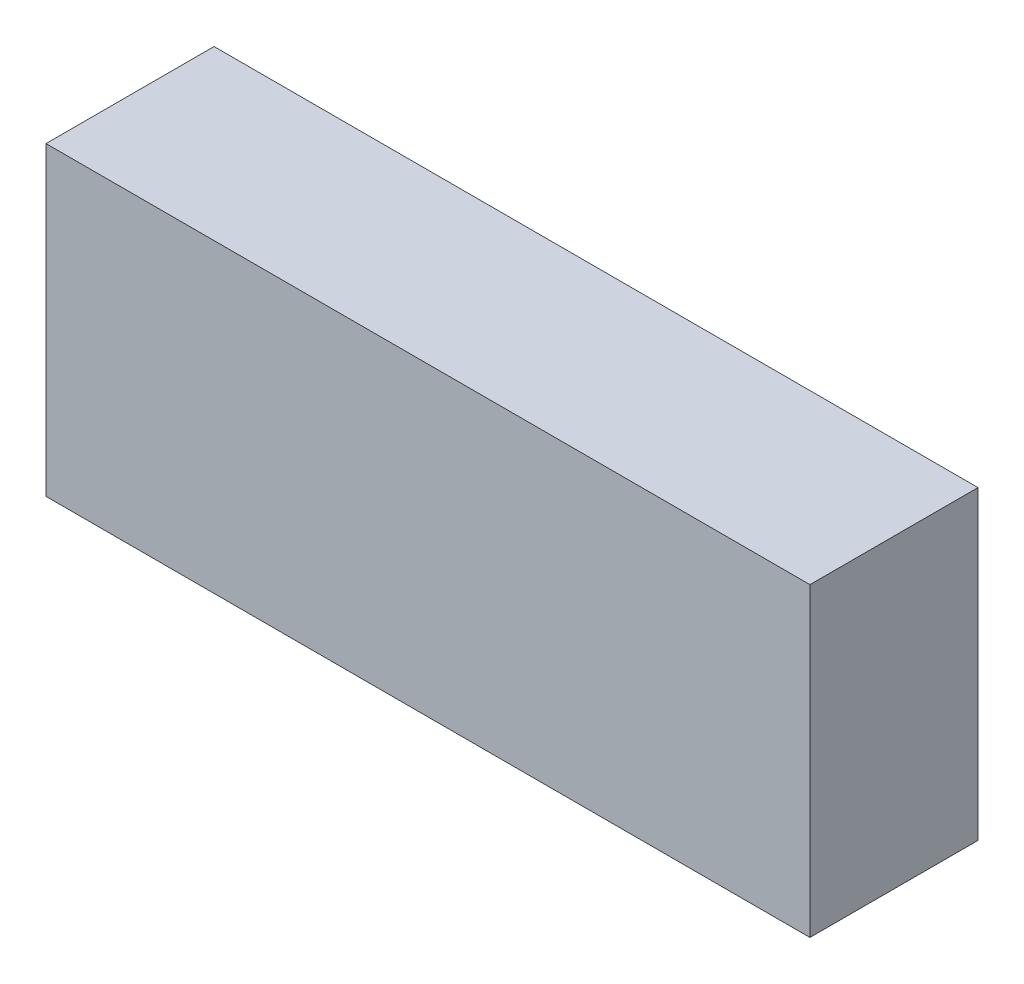
ISO-10303-21;
HEADER;
FILE_DESCRIPTION(('STEP AP214'),'2;1');
FILE_NAME('part.step','',(''),(''),'','','');
FILE_SCHEMA(('AUTOMOTIVE_DESIGN { 1 0 10303 214 1 1 1 1 }'));
ENDSEC;
DATA;
#1=APPLICATION_CONTEXT('core data for automotive mechanical design processes');
#2=APPLICATION_PROTOCOL_DEFINITION('international standard','automotive_design',2000,#1);
#3=PRODUCT_CONTEXT('',#1,'mechanical');
#4=PRODUCT('Part','Part','',(#3));
#5=PRODUCT_RELATED_PRODUCT_CATEGORY('part','',(#4));
#6=PRODUCT_DEFINITION_FORMATION('','',#4);
#7=PRODUCT_DEFINITION_CONTEXT('part definition',#1,'design');
#8=PRODUCT_DEFINITION('design','',#6,#7);
#9=PRODUCT_DEFINITION_SHAPE('','',#8);
#10=(LENGTH_UNIT() NAMED_UNIT(*) SI_UNIT(.MILLI.,.METRE.));
#11=(NAMED_UNIT(*) PLANE_ANGLE_UNIT() SI_UNIT($,.RADIAN.));
#12=(NAMED_UNIT(*) SI_UNIT($,.STERADIAN.) SOLID_ANGLE_UNIT());
#13=UNCERTAINTY_MEASURE_WITH_UNIT(LENGTH_MEASURE(1.E-05),#10,'distance_accuracy_value','');
#14=(GEOMETRIC_REPRESENTATION_CONTEXT(3) GLOBAL_UNCERTAINTY_ASSIGNED_CONTEXT((#13)) GLOBAL_UNIT_ASSIGNED_CONTEXT((#10,
#11,#12)) REPRESENTATION_CONTEXT('',''));
#15=CARTESIAN_POINT('',(0.,0.,0.));
#16=DIRECTION('',(0.,0.,1.));
#17=DIRECTION('',(1.,0.,0.));
#18=AXIS2_PLACEMENT_3D('',#15,#16,#17);
#19=CARTESIAN_POINT('',(0.,0.,22.));
#20=DIRECTION('',(1.,0.,0.));
#21=DIRECTION('',(0.,1.,0.));
#22=AXIS2_PLACEMENT_3D('',#19,#20,#21);
#23=PLANE('',#22);
#24=DIRECTION('',(0.,-1.,0.));
#25=VECTOR('',#24,1.);
#26=CARTESIAN_POINT('',(0.,0.,0.));
#27=LINE('',#26,#25);
#28=CARTESIAN_POINT('',(0.,0.,0.));
#29=VERTEX_POINT('',#28);
#30=CARTESIAN_POINT('',(0.,-40.,0.));
#31=VERTEX_POINT('',#30);
#32=EDGE_CURVE('E96',#29,#31,#27,.T.);
#33=ORIENTED_EDGE('',*,*,#32,.T.);
#34=DIRECTION('',(0.,0.,-1.));
#35=VECTOR('',#34,1.);
#36=CARTESIAN_POINT('',(0.,-40.,22.));
#37=LINE('',#36,#35);
#38=CARTESIAN_POINT('',(0.,-40.,22.));
#39=VERTEX_POINT('',#38);
#40=EDGE_CURVE('E11',#39,#31,#37,.T.);
#41=ORIENTED_EDGE('',*,*,#40,.F.);
#42=DIRECTION('',(0.,-1.,0.));
#43=VECTOR('',#42,1.);
#44=CARTESIAN_POINT('',(0.,0.,22.));
#45=LINE('',#44,#43);
#46=CARTESIAN_POINT('',(0.,0.,22.));
#47=VERTEX_POINT('',#46);
#48=EDGE_CURVE('E84',#47,#39,#45,.T.);
#49=ORIENTED_EDGE('',*,*,#48,.F.);
#50=DIRECTION('',(0.,0.,-1.));
#51=VECTOR('',#50,1.);
#52=CARTESIAN_POINT('',(0.,0.,22.));
#53=LINE('',#52,#51);
#54=EDGE_CURVE('E92',#47,#29,#53,.T.);
#55=ORIENTED_EDGE('',*,*,#54,.T.);
#56=EDGE_LOOP('',(#33,#41,#49,#55));
#57=FACE_BOUND('',#56,.T.);
#58=ADVANCED_FACE('F33',(#57),#23,.F.);
#59=CARTESIAN_POINT('',(0.,-40.,22.));
#60=DIRECTION('',(0.,1.,0.));
#61=DIRECTION('',(0.,0.,1.));
#62=AXIS2_PLACEMENT_3D('',#59,#60,#61);
#63=PLANE('',#62);
#64=DIRECTION('',(1.,0.,0.));
#65=VECTOR('',#64,1.);
#66=CARTESIAN_POINT('',(0.,-40.,0.));
#67=LINE('',#66,#65);
#68=CARTESIAN_POINT('',(100.,-40.,0.));
#69=VERTEX_POINT('',#68);
#70=EDGE_CURVE('E88',#31,#69,#67,.T.);
#71=ORIENTED_EDGE('',*,*,#70,.T.);
#72=DIRECTION('',(0.,0.,-1.));
#73=VECTOR('',#72,1.);
#74=CARTESIAN_POINT('',(100.,-40.,22.));
#75=LINE('',#74,#73);
#76=CARTESIAN_POINT('',(100.,-40.,22.));
#77=VERTEX_POINT('',#76);
#78=EDGE_CURVE('E41',#77,#69,#75,.T.);
#79=ORIENTED_EDGE('',*,*,#78,.F.);
#80=DIRECTION('',(1.,0.,0.));
#81=VECTOR('',#80,1.);
#82=CARTESIAN_POINT('',(0.,-40.,22.));
#83=LINE('',#82,#81);
#84=EDGE_CURVE('E79',#39,#77,#83,.T.);
#85=ORIENTED_EDGE('',*,*,#84,.F.);
#86=ORIENTED_EDGE('',*,*,#40,.T.);
#87=EDGE_LOOP('',(#71,#79,#85,#86));
#88=FACE_BOUND('',#87,.T.);
#89=ADVANCED_FACE('F87',(#88),#63,.F.);
#90=CARTESIAN_POINT('',(100.,0.,22.));
#91=DIRECTION('',(-1.,0.,0.));
#92=DIRECTION('',(0.,0.,1.));
#93=AXIS2_PLACEMENT_3D('',#90,#91,#92);
#94=PLANE('',#93);
#95=DIRECTION('',(0.,1.,0.));
#96=VECTOR('',#95,1.);
#97=CARTESIAN_POINT('',(100.,0.,0.));
#98=LINE('',#97,#96);
#99=CARTESIAN_POINT('',(100.,0.,0.));
#100=VERTEX_POINT('',#99);
#101=EDGE_CURVE('E66',#69,#100,#98,.T.);
#102=ORIENTED_EDGE('',*,*,#101,.T.);
#103=DIRECTION('',(0.,0.,-1.));
#104=VECTOR('',#103,1.);
#105=CARTESIAN_POINT('',(100.,0.,22.));
#106=LINE('',#105,#104);
#107=CARTESIAN_POINT('',(100.,0.,22.));
#108=VERTEX_POINT('',#107);
#109=EDGE_CURVE('E89',#108,#100,#106,.T.);
#110=ORIENTED_EDGE('',*,*,#109,.F.);
#111=DIRECTION('',(0.,1.,0.));
#112=VECTOR('',#111,1.);
#113=CARTESIAN_POINT('',(100.,0.,22.));
#114=LINE('',#113,#112);
#115=EDGE_CURVE('E82',#77,#108,#114,.T.);
#116=ORIENTED_EDGE('',*,*,#115,.F.);
#117=ORIENTED_EDGE('',*,*,#78,.T.);
#118=EDGE_LOOP('',(#102,#110,#116,#117));
#119=FACE_BOUND('',#118,.T.);
#120=ADVANCED_FACE('F90',(#119),#94,.F.);
#121=CARTESIAN_POINT('',(0.,0.,22.));
#122=DIRECTION('',(0.,-1.,0.));
#123=DIRECTION('',(0.,0.,-1.));
#124=AXIS2_PLACEMENT_3D('',#121,#122,#123);
#125=PLANE('',#124);
#126=DIRECTION('',(-1.,0.,0.));
#127=VECTOR('',#126,1.);
#128=CARTESIAN_POINT('',(0.,0.,0.));
#129=LINE('',#128,#127);
#130=EDGE_CURVE('E72',#100,#29,#129,.T.);
#131=ORIENTED_EDGE('',*,*,#130,.T.);
#132=ORIENTED_EDGE('',*,*,#54,.F.);
#133=DIRECTION('',(-1.,0.,0.));
#134=VECTOR('',#133,1.);
#135=CARTESIAN_POINT('',(0.,0.,22.));
#136=LINE('',#135,#134);
#137=EDGE_CURVE('E49',#108,#47,#136,.T.);
#138=ORIENTED_EDGE('',*,*,#137,.F.);
#139=ORIENTED_EDGE('',*,*,#109,.T.);
#140=EDGE_LOOP('',(#131,#132,#138,#139));
#141=FACE_BOUND('',#140,.T.);
#142=ADVANCED_FACE('F103',(#141),#125,.F.);
#143=CARTESIAN_POINT('',(0.,0.,22.));
#144=DIRECTION('',(0.,0.,1.));
#145=DIRECTION('',(1.,0.,0.));
#146=AXIS2_PLACEMENT_3D('',#143,#144,#145);
#147=PLANE('',#146);
#148=ORIENTED_EDGE('',*,*,#48,.T.);
#149=ORIENTED_EDGE('',*,*,#84,.T.);
#150=ORIENTED_EDGE('',*,*,#115,.T.);
#151=ORIENTED_EDGE('',*,*,#137,.T.);
#152=EDGE_LOOP('',(#148,#149,#150,#151));
#153=FACE_BOUND('',#152,.T.);
#154=ADVANCED_FACE('F80',(#153),#147,.T.);
#155=CARTESIAN_POINT('',(0.,0.,0.));
#156=DIRECTION('',(0.,0.,1.));
#157=DIRECTION('',(1.,0.,0.));
#158=AXIS2_PLACEMENT_3D('',#155,#156,#157);
#159=PLANE('',#158);
#160=ORIENTED_EDGE('',*,*,#32,.F.);
#161=ORIENTED_EDGE('',*,*,#130,.F.);
#162=ORIENTED_EDGE('',*,*,#101,.F.);
#163=ORIENTED_EDGE('',*,*,#70,.F.);
#164=EDGE_LOOP('',(#160,#161,#162,#163));
#165=FACE_BOUND('',#164,.T.);
#166=ADVANCED_FACE('F106',(#165),#159,.F.);
#167=CLOSED_SHELL('',(#58,#89,#120,#142,#154,#166));
#168=MANIFOLD_SOLID_BREP('B2',#167);
#169=ADVANCED_BREP_SHAPE_REPRESENTATION('',(#18,#168),#14);
#170=SHAPE_DEFINITION_REPRESENTATION(#9,#169);
ENDSEC;
END-ISO-10303-21;
